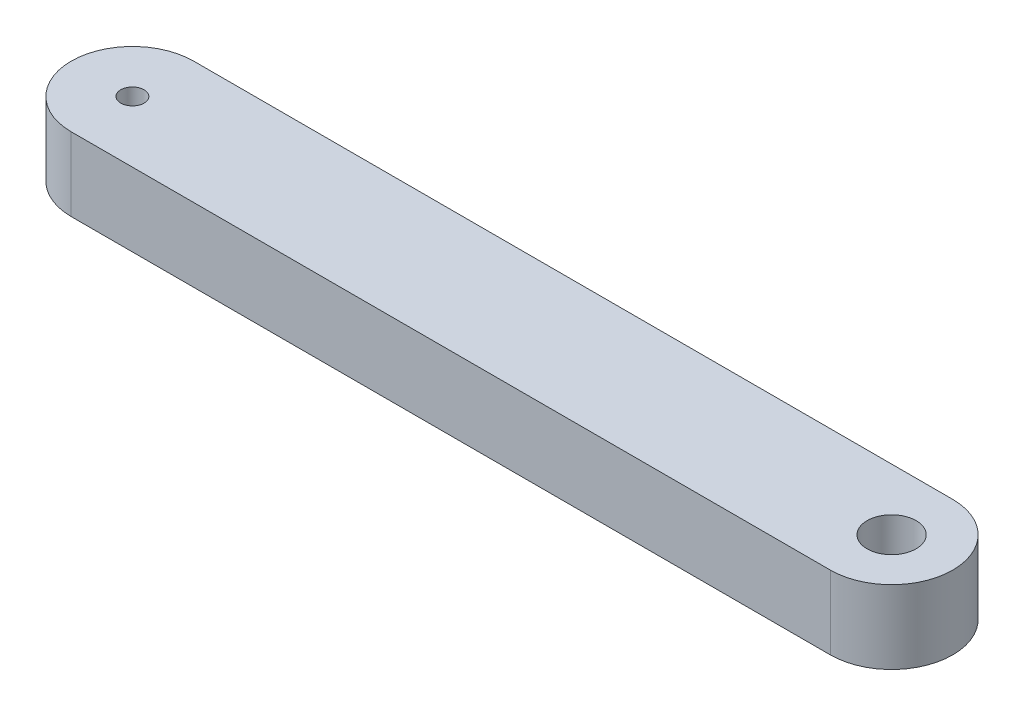
ISO-10303-21;
HEADER;
FILE_DESCRIPTION(('STEP AP214'),'2;1');
FILE_NAME('part.step','',(''),(''),'','','');
FILE_SCHEMA(('AUTOMOTIVE_DESIGN { 1 0 10303 214 1 1 1 1 }'));
ENDSEC;
DATA;
#1=APPLICATION_CONTEXT('core data for automotive mechanical design processes');
#2=APPLICATION_PROTOCOL_DEFINITION('international standard','automotive_design',2000,#1);
#3=PRODUCT_CONTEXT('',#1,'mechanical');
#4=PRODUCT('Part','Part','',(#3));
#5=PRODUCT_RELATED_PRODUCT_CATEGORY('part','',(#4));
#6=PRODUCT_DEFINITION_FORMATION('','',#4);
#7=PRODUCT_DEFINITION_CONTEXT('part definition',#1,'design');
#8=PRODUCT_DEFINITION('design','',#6,#7);
#9=PRODUCT_DEFINITION_SHAPE('','',#8);
#10=(LENGTH_UNIT() NAMED_UNIT(*) SI_UNIT(.MILLI.,.METRE.));
#11=(NAMED_UNIT(*) PLANE_ANGLE_UNIT() SI_UNIT($,.RADIAN.));
#12=(NAMED_UNIT(*) SI_UNIT($,.STERADIAN.) SOLID_ANGLE_UNIT());
#13=UNCERTAINTY_MEASURE_WITH_UNIT(LENGTH_MEASURE(1.E-05),#10,'distance_accuracy_value','');
#14=(GEOMETRIC_REPRESENTATION_CONTEXT(3) GLOBAL_UNCERTAINTY_ASSIGNED_CONTEXT((#13)) GLOBAL_UNIT_ASSIGNED_CONTEXT((#10,
#11,#12)) REPRESENTATION_CONTEXT('',''));
#15=CARTESIAN_POINT('',(0.,0.,0.));
#16=DIRECTION('',(0.,0.,1.));
#17=DIRECTION('',(1.,0.,0.));
#18=AXIS2_PLACEMENT_3D('',#15,#16,#17);
#19=CARTESIAN_POINT('',(0.,0.,0.));
#20=DIRECTION('',(0.,1.,0.));
#21=DIRECTION('',(0.,0.,1.));
#22=AXIS2_PLACEMENT_3D('',#19,#20,#21);
#23=PLANE('',#22);
#24=CARTESIAN_POINT('',(-15.5,0.,0.));
#25=DIRECTION('',(0.,-1.,0.));
#26=DIRECTION('',(1.,0.,0.));
#27=AXIS2_PLACEMENT_3D('',#24,#25,#26);
#28=CIRCLE('',#27,0.475);
#29=CARTESIAN_POINT('',(-15.975,0.,0.));
#30=VERTEX_POINT('',#29);
#31=EDGE_CURVE('E112',#30,#30,#28,.T.);
#32=ORIENTED_EDGE('',*,*,#31,.F.);
#33=EDGE_LOOP('',(#32));
#34=FACE_BOUND('',#33,.T.);
#35=CARTESIAN_POINT('',(15.5,0.,0.));
#36=DIRECTION('',(0.,-1.,0.));
#37=DIRECTION('',(1.,0.,0.));
#38=AXIS2_PLACEMENT_3D('',#35,#36,#37);
#39=CIRCLE('',#38,1.);
#40=CARTESIAN_POINT('',(14.5,0.,0.));
#41=VERTEX_POINT('',#40);
#42=EDGE_CURVE('E102',#41,#41,#39,.T.);
#43=ORIENTED_EDGE('',*,*,#42,.F.);
#44=EDGE_LOOP('',(#43));
#45=FACE_BOUND('',#44,.T.);
#46=CARTESIAN_POINT('',(15.5,0.,0.));
#47=DIRECTION('',(0.,1.,0.));
#48=DIRECTION('',(0.,0.,1.));
#49=AXIS2_PLACEMENT_3D('',#46,#47,#48);
#50=CIRCLE('',#49,2.5);
#51=CARTESIAN_POINT('',(15.5,0.,2.5));
#52=VERTEX_POINT('',#51);
#53=CARTESIAN_POINT('',(15.5,0.,-2.5));
#54=VERTEX_POINT('',#53);
#55=EDGE_CURVE('E26',#52,#54,#50,.T.);
#56=ORIENTED_EDGE('',*,*,#55,.F.);
#57=DIRECTION('',(1.,0.,0.));
#58=VECTOR('',#57,1.);
#59=CARTESIAN_POINT('',(-15.5,0.,2.5));
#60=LINE('',#59,#58);
#61=CARTESIAN_POINT('',(-15.5,0.,2.5));
#62=VERTEX_POINT('',#61);
#63=EDGE_CURVE('E87',#62,#52,#60,.T.);
#64=ORIENTED_EDGE('',*,*,#63,.F.);
#65=CARTESIAN_POINT('',(-15.5,0.,0.));
#66=DIRECTION('',(0.,1.,0.));
#67=DIRECTION('',(0.,0.,-1.));
#68=AXIS2_PLACEMENT_3D('',#65,#66,#67);
#69=CIRCLE('',#68,2.5);
#70=CARTESIAN_POINT('',(-15.5,0.,-2.5));
#71=VERTEX_POINT('',#70);
#72=EDGE_CURVE('E19',#71,#62,#69,.T.);
#73=ORIENTED_EDGE('',*,*,#72,.F.);
#74=DIRECTION('',(-1.,0.,0.));
#75=VECTOR('',#74,1.);
#76=CARTESIAN_POINT('',(15.5,0.,-2.5));
#77=LINE('',#76,#75);
#78=EDGE_CURVE('E69',#54,#71,#77,.T.);
#79=ORIENTED_EDGE('',*,*,#78,.F.);
#80=EDGE_LOOP('',(#56,#64,#73,#79));
#81=FACE_BOUND('',#80,.T.);
#82=ADVANCED_FACE('F16',(#34,#45,#81),#23,.F.);
#83=CARTESIAN_POINT('',(0.,3.,0.));
#84=DIRECTION('',(0.,1.,0.));
#85=DIRECTION('',(0.,0.,1.));
#86=AXIS2_PLACEMENT_3D('',#83,#84,#85);
#87=PLANE('',#86);
#88=CARTESIAN_POINT('',(-15.5,3.,0.));
#89=DIRECTION('',(0.,-1.,0.));
#90=DIRECTION('',(1.,0.,0.));
#91=AXIS2_PLACEMENT_3D('',#88,#89,#90);
#92=CIRCLE('',#91,0.475);
#93=CARTESIAN_POINT('',(-15.975,3.,0.));
#94=VERTEX_POINT('',#93);
#95=EDGE_CURVE('E119',#94,#94,#92,.T.);
#96=ORIENTED_EDGE('',*,*,#95,.T.);
#97=EDGE_LOOP('',(#96));
#98=FACE_BOUND('',#97,.T.);
#99=CARTESIAN_POINT('',(15.5,3.,0.));
#100=DIRECTION('',(0.,-1.,0.));
#101=DIRECTION('',(1.,0.,0.));
#102=AXIS2_PLACEMENT_3D('',#99,#100,#101);
#103=CIRCLE('',#102,1.);
#104=CARTESIAN_POINT('',(14.5,3.,0.));
#105=VERTEX_POINT('',#104);
#106=EDGE_CURVE('E104',#105,#105,#103,.T.);
#107=ORIENTED_EDGE('',*,*,#106,.T.);
#108=EDGE_LOOP('',(#107));
#109=FACE_BOUND('',#108,.T.);
#110=CARTESIAN_POINT('',(15.5,3.,0.));
#111=DIRECTION('',(0.,1.,0.));
#112=DIRECTION('',(0.,0.,1.));
#113=AXIS2_PLACEMENT_3D('',#110,#111,#112);
#114=CIRCLE('',#113,2.5);
#115=CARTESIAN_POINT('',(15.5,3.,2.5));
#116=VERTEX_POINT('',#115);
#117=CARTESIAN_POINT('',(15.5,3.,-2.5));
#118=VERTEX_POINT('',#117);
#119=EDGE_CURVE('E11',#116,#118,#114,.T.);
#120=ORIENTED_EDGE('',*,*,#119,.T.);
#121=DIRECTION('',(-1.,0.,0.));
#122=VECTOR('',#121,1.);
#123=CARTESIAN_POINT('',(15.5,3.,-2.5));
#124=LINE('',#123,#122);
#125=CARTESIAN_POINT('',(-15.5,3.,-2.5));
#126=VERTEX_POINT('',#125);
#127=EDGE_CURVE('E78',#118,#126,#124,.T.);
#128=ORIENTED_EDGE('',*,*,#127,.T.);
#129=CARTESIAN_POINT('',(-15.5,3.,0.));
#130=DIRECTION('',(0.,1.,0.));
#131=DIRECTION('',(0.,0.,-1.));
#132=AXIS2_PLACEMENT_3D('',#129,#130,#131);
#133=CIRCLE('',#132,2.5);
#134=CARTESIAN_POINT('',(-15.5,3.,2.5));
#135=VERTEX_POINT('',#134);
#136=EDGE_CURVE('E62',#126,#135,#133,.T.);
#137=ORIENTED_EDGE('',*,*,#136,.T.);
#138=DIRECTION('',(1.,0.,0.));
#139=VECTOR('',#138,1.);
#140=CARTESIAN_POINT('',(-15.5,3.,2.5));
#141=LINE('',#140,#139);
#142=EDGE_CURVE('E94',#135,#116,#141,.T.);
#143=ORIENTED_EDGE('',*,*,#142,.T.);
#144=EDGE_LOOP('',(#120,#128,#137,#143));
#145=FACE_BOUND('',#144,.T.);
#146=ADVANCED_FACE('F130',(#98,#109,#145),#87,.T.);
#147=CARTESIAN_POINT('',(15.5,0.,0.));
#148=DIRECTION('',(0.,-1.,0.));
#149=DIRECTION('',(0.,0.,1.));
#150=AXIS2_PLACEMENT_3D('',#147,#148,#149);
#151=CYLINDRICAL_SURFACE('',#150,2.5);
#152=ORIENTED_EDGE('',*,*,#55,.T.);
#153=DIRECTION('',(0.,1.,0.));
#154=VECTOR('',#153,1.);
#155=CARTESIAN_POINT('',(15.5,0.,-2.5));
#156=LINE('',#155,#154);
#157=EDGE_CURVE('E74',#54,#118,#156,.T.);
#158=ORIENTED_EDGE('',*,*,#157,.T.);
#159=ORIENTED_EDGE('',*,*,#119,.F.);
#160=DIRECTION('',(0.,1.,0.));
#161=VECTOR('',#160,1.);
#162=CARTESIAN_POINT('',(15.5,0.,2.5));
#163=LINE('',#162,#161);
#164=EDGE_CURVE('E98',#52,#116,#163,.T.);
#165=ORIENTED_EDGE('',*,*,#164,.F.);
#166=EDGE_LOOP('',(#152,#158,#159,#165));
#167=FACE_BOUND('',#166,.T.);
#168=ADVANCED_FACE('F132',(#167),#151,.T.);
#169=CARTESIAN_POINT('',(15.5,0.,-2.5));
#170=DIRECTION('',(0.,0.,-1.));
#171=DIRECTION('',(-1.,0.,0.));
#172=AXIS2_PLACEMENT_3D('',#169,#170,#171);
#173=PLANE('',#172);
#174=ORIENTED_EDGE('',*,*,#78,.T.);
#175=DIRECTION('',(0.,1.,0.));
#176=VECTOR('',#175,1.);
#177=CARTESIAN_POINT('',(-15.5,0.,-2.5));
#178=LINE('',#177,#176);
#179=EDGE_CURVE('E73',#71,#126,#178,.T.);
#180=ORIENTED_EDGE('',*,*,#179,.T.);
#181=ORIENTED_EDGE('',*,*,#127,.F.);
#182=ORIENTED_EDGE('',*,*,#157,.F.);
#183=EDGE_LOOP('',(#174,#180,#181,#182));
#184=FACE_BOUND('',#183,.T.);
#185=ADVANCED_FACE('F71',(#184),#173,.T.);
#186=CARTESIAN_POINT('',(-15.5,0.,0.));
#187=DIRECTION('',(0.,-1.,0.));
#188=DIRECTION('',(0.,0.,-1.));
#189=AXIS2_PLACEMENT_3D('',#186,#187,#188);
#190=CYLINDRICAL_SURFACE('',#189,2.5);
#191=ORIENTED_EDGE('',*,*,#72,.T.);
#192=DIRECTION('',(0.,1.,0.));
#193=VECTOR('',#192,1.);
#194=CARTESIAN_POINT('',(-15.5,0.,2.5));
#195=LINE('',#194,#193);
#196=EDGE_CURVE('E89',#62,#135,#195,.T.);
#197=ORIENTED_EDGE('',*,*,#196,.T.);
#198=ORIENTED_EDGE('',*,*,#136,.F.);
#199=ORIENTED_EDGE('',*,*,#179,.F.);
#200=EDGE_LOOP('',(#191,#197,#198,#199));
#201=FACE_BOUND('',#200,.T.);
#202=ADVANCED_FACE('F81',(#201),#190,.T.);
#203=CARTESIAN_POINT('',(-15.5,0.,2.5));
#204=DIRECTION('',(0.,0.,1.));
#205=DIRECTION('',(1.,0.,0.));
#206=AXIS2_PLACEMENT_3D('',#203,#204,#205);
#207=PLANE('',#206);
#208=ORIENTED_EDGE('',*,*,#63,.T.);
#209=ORIENTED_EDGE('',*,*,#164,.T.);
#210=ORIENTED_EDGE('',*,*,#142,.F.);
#211=ORIENTED_EDGE('',*,*,#196,.F.);
#212=EDGE_LOOP('',(#208,#209,#210,#211));
#213=FACE_BOUND('',#212,.T.);
#214=ADVANCED_FACE('F144',(#213),#207,.T.);
#215=CARTESIAN_POINT('',(15.5,0.,0.));
#216=DIRECTION('',(0.,-1.,0.));
#217=DIRECTION('',(1.,0.,0.));
#218=AXIS2_PLACEMENT_3D('',#215,#216,#217);
#219=CYLINDRICAL_SURFACE('',#218,1.);
#220=ORIENTED_EDGE('',*,*,#42,.T.);
#221=EDGE_LOOP('',(#220));
#222=FACE_BOUND('',#221,.T.);
#223=ORIENTED_EDGE('',*,*,#106,.F.);
#224=EDGE_LOOP('',(#223));
#225=FACE_BOUND('',#224,.T.);
#226=ADVANCED_FACE('F146',(#222,#225),#219,.F.);
#227=CARTESIAN_POINT('',(-15.5,0.,0.));
#228=DIRECTION('',(0.,-1.,0.));
#229=DIRECTION('',(1.,0.,0.));
#230=AXIS2_PLACEMENT_3D('',#227,#228,#229);
#231=CYLINDRICAL_SURFACE('',#230,0.475);
#232=ORIENTED_EDGE('',*,*,#31,.T.);
#233=EDGE_LOOP('',(#232));
#234=FACE_BOUND('',#233,.T.);
#235=ORIENTED_EDGE('',*,*,#95,.F.);
#236=EDGE_LOOP('',(#235));
#237=FACE_BOUND('',#236,.T.);
#238=ADVANCED_FACE('F152',(#234,#237),#231,.F.);
#239=CLOSED_SHELL('',(#82,#146,#168,#185,#202,#214,#226,#238));
#240=MANIFOLD_SOLID_BREP('B1',#239);
#241=ADVANCED_BREP_SHAPE_REPRESENTATION('',(#18,#240),#14);
#242=SHAPE_DEFINITION_REPRESENTATION(#9,#241);
ENDSEC;
END-ISO-10303-21;
